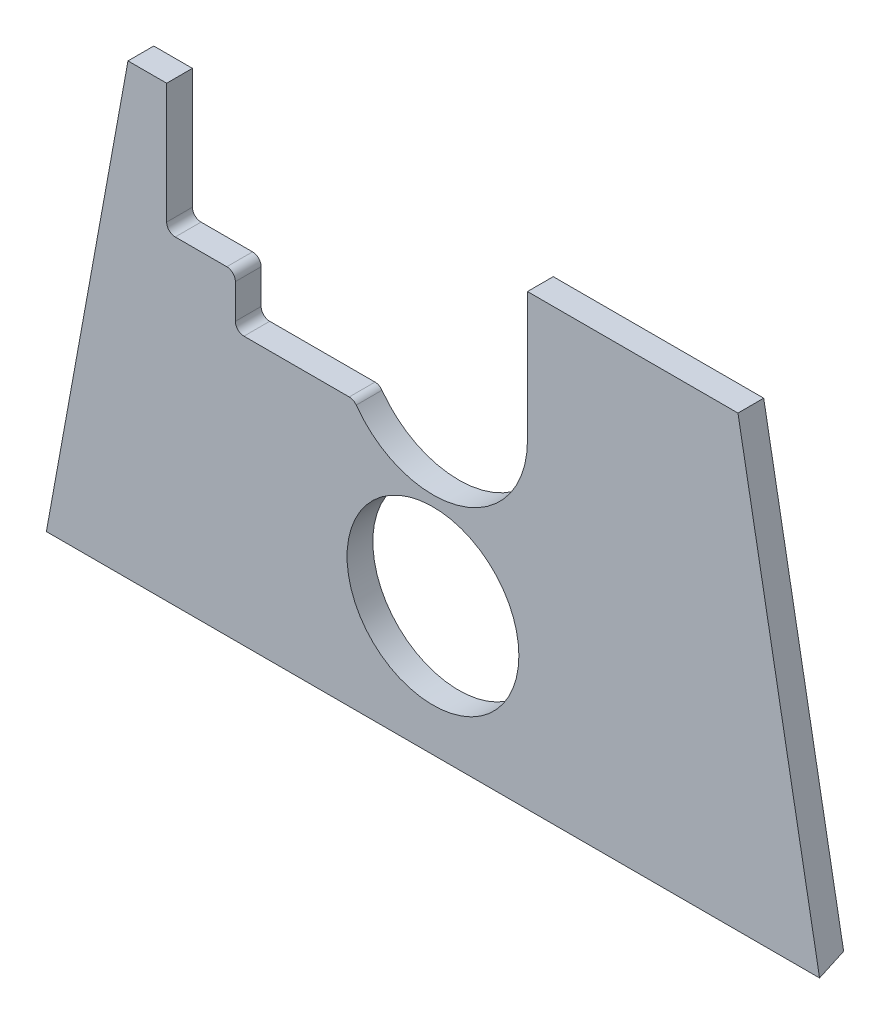
ISO-10303-21;
HEADER;
FILE_DESCRIPTION(('STEP AP214'),'2;1');
FILE_NAME('part.step','',(''),(''),'','','');
FILE_SCHEMA(('AUTOMOTIVE_DESIGN { 1 0 10303 214 1 1 1 1 }'));
ENDSEC;
DATA;
#1=APPLICATION_CONTEXT('core data for automotive mechanical design processes');
#2=APPLICATION_PROTOCOL_DEFINITION('international standard','automotive_design',2000,#1);
#3=PRODUCT_CONTEXT('',#1,'mechanical');
#4=PRODUCT('Part','Part','',(#3));
#5=PRODUCT_RELATED_PRODUCT_CATEGORY('part','',(#4));
#6=PRODUCT_DEFINITION_FORMATION('','',#4);
#7=PRODUCT_DEFINITION_CONTEXT('part definition',#1,'design');
#8=PRODUCT_DEFINITION('design','',#6,#7);
#9=PRODUCT_DEFINITION_SHAPE('','',#8);
#10=(LENGTH_UNIT() NAMED_UNIT(*) SI_UNIT(.MILLI.,.METRE.));
#11=(NAMED_UNIT(*) PLANE_ANGLE_UNIT() SI_UNIT($,.RADIAN.));
#12=(NAMED_UNIT(*) SI_UNIT($,.STERADIAN.) SOLID_ANGLE_UNIT());
#13=UNCERTAINTY_MEASURE_WITH_UNIT(LENGTH_MEASURE(1.E-05),#10,'distance_accuracy_value','');
#14=(GEOMETRIC_REPRESENTATION_CONTEXT(3) GLOBAL_UNCERTAINTY_ASSIGNED_CONTEXT((#13)) GLOBAL_UNIT_ASSIGNED_CONTEXT((#10,
#11,#12)) REPRESENTATION_CONTEXT('',''));
#15=CARTESIAN_POINT('',(0.,0.,0.));
#16=DIRECTION('',(0.,0.,1.));
#17=DIRECTION('',(1.,0.,0.));
#18=AXIS2_PLACEMENT_3D('',#15,#16,#17);
#19=CARTESIAN_POINT('',(-35.5,52.2,1.5));
#20=DIRECTION('',(0.,-1.,0.));
#21=DIRECTION('',(0.,0.,-1.));
#22=AXIS2_PLACEMENT_3D('',#19,#20,#21);
#23=PLANE('',#22);
#24=DIRECTION('',(-1.,0.,0.));
#25=VECTOR('',#24,1.);
#26=CARTESIAN_POINT('',(-35.5,52.2,1.5));
#27=LINE('',#26,#25);
#28=CARTESIAN_POINT('',(-31.,52.2,1.5));
#29=VERTEX_POINT('',#28);
#30=CARTESIAN_POINT('',(-35.5,52.2,1.5));
#31=VERTEX_POINT('',#30);
#32=EDGE_CURVE('E308',#29,#31,#27,.T.);
#33=ORIENTED_EDGE('',*,*,#32,.F.);
#34=DIRECTION('',(0.,0.,1.));
#35=VECTOR('',#34,1.);
#36=CARTESIAN_POINT('',(-31.,52.2,-1.5));
#37=LINE('',#36,#35);
#38=CARTESIAN_POINT('',(-31.,52.2,-1.5));
#39=VERTEX_POINT('',#38);
#40=EDGE_CURVE('E161',#39,#29,#37,.T.);
#41=ORIENTED_EDGE('',*,*,#40,.F.);
#42=DIRECTION('',(-1.,0.,0.));
#43=VECTOR('',#42,1.);
#44=CARTESIAN_POINT('',(-35.5,52.2,-1.5));
#45=LINE('',#44,#43);
#46=CARTESIAN_POINT('',(-35.5,52.2,-1.5));
#47=VERTEX_POINT('',#46);
#48=EDGE_CURVE('E180',#39,#47,#45,.T.);
#49=ORIENTED_EDGE('',*,*,#48,.T.);
#50=DIRECTION('',(0.,0.,-1.));
#51=VECTOR('',#50,1.);
#52=CARTESIAN_POINT('',(-35.5,52.2,1.5));
#53=LINE('',#52,#51);
#54=EDGE_CURVE('E191',#31,#47,#53,.T.);
#55=ORIENTED_EDGE('',*,*,#54,.F.);
#56=EDGE_LOOP('',(#33,#41,#49,#55));
#57=FACE_BOUND('',#56,.T.);
#58=ADVANCED_FACE('F40',(#57),#23,.F.);
#59=CARTESIAN_POINT('',(35.5,52.2,1.5));
#60=DIRECTION('',(-0.983839740112605,-0.179051293698654,0.));
#61=DIRECTION('',(0.179051293698654,-0.983839740112605,0.));
#62=AXIS2_PLACEMENT_3D('',#59,#60,#61);
#63=PLANE('',#62);
#64=DIRECTION('',(-0.179051293698654,0.983839740112605,0.));
#65=VECTOR('',#64,1.);
#66=CARTESIAN_POINT('',(35.5,52.2,1.5));
#67=LINE('',#66,#65);
#68=CARTESIAN_POINT('',(45.,0.,1.5));
#69=VERTEX_POINT('',#68);
#70=CARTESIAN_POINT('',(35.5,52.2,1.5));
#71=VERTEX_POINT('',#70);
#72=EDGE_CURVE('E185',#69,#71,#67,.T.);
#73=ORIENTED_EDGE('',*,*,#72,.F.);
#74=DIRECTION('',(0.0621248119839871,-0.341359493217276,0.937877499530935));
#75=VECTOR('',#74,1.);
#76=CARTESIAN_POINT('',(44.6526456962359,1.90862049015652,-3.74389169901341));
#77=LINE('',#76,#75);
#78=CARTESIAN_POINT('',(44.8012806192225,1.09191070279862,-1.5));
#79=VERTEX_POINT('',#78);
#80=EDGE_CURVE('E198',#69,#79,#77,.F.);
#81=ORIENTED_EDGE('',*,*,#80,.T.);
#82=DIRECTION('',(-0.179051293698654,0.983839740112605,0.));
#83=VECTOR('',#82,1.);
#84=CARTESIAN_POINT('',(35.5,52.2,-1.5));
#85=LINE('',#84,#83);
#86=CARTESIAN_POINT('',(35.5,52.2,-1.5));
#87=VERTEX_POINT('',#86);
#88=EDGE_CURVE('E187',#79,#87,#85,.T.);
#89=ORIENTED_EDGE('',*,*,#88,.T.);
#90=DIRECTION('',(0.,0.,-1.));
#91=VECTOR('',#90,1.);
#92=CARTESIAN_POINT('',(35.5,52.2,1.5));
#93=LINE('',#92,#91);
#94=EDGE_CURVE('E177',#71,#87,#93,.T.);
#95=ORIENTED_EDGE('',*,*,#94,.F.);
#96=EDGE_LOOP('',(#73,#81,#89,#95));
#97=FACE_BOUND('',#96,.T.);
#98=ADVANCED_FACE('F323',(#97),#63,.F.);
#99=CARTESIAN_POINT('',(11.,52.2,-1.5));
#100=VERTEX_POINT('',#99);
#101=EDGE_CURVE('E168',#87,#100,#45,.T.);
#102=ORIENTED_EDGE('',*,*,#101,.T.);
#103=DIRECTION('',(0.,0.,1.));
#104=VECTOR('',#103,1.);
#105=CARTESIAN_POINT('',(11.,52.2,-1.5));
#106=LINE('',#105,#104);
#107=CARTESIAN_POINT('',(11.,52.2,1.5));
#108=VERTEX_POINT('',#107);
#109=EDGE_CURVE('E149',#100,#108,#106,.T.);
#110=ORIENTED_EDGE('',*,*,#109,.T.);
#111=EDGE_CURVE('E309',#71,#108,#27,.T.);
#112=ORIENTED_EDGE('',*,*,#111,.F.);
#113=ORIENTED_EDGE('',*,*,#94,.T.);
#114=EDGE_LOOP('',(#102,#110,#112,#113));
#115=FACE_BOUND('',#114,.T.);
#116=ADVANCED_FACE('F175',(#115),#23,.F.);
#117=CARTESIAN_POINT('',(-45.,0.,1.5));
#118=DIRECTION('',(0.983839740112605,-0.179051293698654,0.));
#119=DIRECTION('',(0.179051293698654,0.983839740112605,0.));
#120=AXIS2_PLACEMENT_3D('',#117,#118,#119);
#121=PLANE('',#120);
#122=DIRECTION('',(-0.179051293698654,-0.983839740112605,0.));
#123=VECTOR('',#122,1.);
#124=CARTESIAN_POINT('',(-45.,0.,-1.5));
#125=LINE('',#124,#123);
#126=CARTESIAN_POINT('',(-44.8012806192225,1.09191070279861,-1.5));
#127=VERTEX_POINT('',#126);
#128=EDGE_CURVE('E179',#47,#127,#125,.T.);
#129=ORIENTED_EDGE('',*,*,#128,.T.);
#130=DIRECTION('',(0.0621248119839871,0.341359493217276,-0.937877499530935));
#131=VECTOR('',#130,1.);
#132=CARTESIAN_POINT('',(-45.,0.,1.5));
#133=LINE('',#132,#131);
#134=CARTESIAN_POINT('',(-45.,0.,1.5));
#135=VERTEX_POINT('',#134);
#136=EDGE_CURVE('E204',#127,#135,#133,.F.);
#137=ORIENTED_EDGE('',*,*,#136,.T.);
#138=DIRECTION('',(-0.179051293698654,-0.983839740112605,0.));
#139=VECTOR('',#138,1.);
#140=CARTESIAN_POINT('',(-45.,0.,1.5));
#141=LINE('',#140,#139);
#142=EDGE_CURVE('E312',#31,#135,#141,.T.);
#143=ORIENTED_EDGE('',*,*,#142,.F.);
#144=ORIENTED_EDGE('',*,*,#54,.T.);
#145=EDGE_LOOP('',(#129,#137,#143,#144));
#146=FACE_BOUND('',#145,.T.);
#147=ADVANCED_FACE('F375',(#146),#121,.F.);
#148=CARTESIAN_POINT('',(0.,0.,1.5));
#149=DIRECTION('',(0.,0.,1.));
#150=DIRECTION('',(1.,0.,0.));
#151=AXIS2_PLACEMENT_3D('',#148,#149,#150);
#152=PLANE('',#151);
#153=CARTESIAN_POINT('',(0.,15.,1.5));
#154=DIRECTION('',(0.,0.,1.));
#155=DIRECTION('',(1.,0.,0.));
#156=AXIS2_PLACEMENT_3D('',#153,#154,#155);
#157=CIRCLE('',#156,10.);
#158=CARTESIAN_POINT('',(10.,15.,1.5));
#159=VERTEX_POINT('',#158);
#160=EDGE_CURVE('E301',#159,#159,#157,.T.);
#161=ORIENTED_EDGE('',*,*,#160,.F.);
#162=EDGE_LOOP('',(#161));
#163=FACE_BOUND('',#162,.T.);
#164=CARTESIAN_POINT('',(0.,37.2,1.5));
#165=DIRECTION('',(0.,0.,1.));
#166=DIRECTION('',(1.,0.,0.));
#167=AXIS2_PLACEMENT_3D('',#164,#165,#166);
#168=CIRCLE('',#167,11.);
#169=CARTESIAN_POINT('',(-8.93456148274155,30.7833333333333,1.5));
#170=VERTEX_POINT('',#169);
#171=CARTESIAN_POINT('',(11.,37.2,1.5));
#172=VERTEX_POINT('',#171);
#173=EDGE_CURVE('E289',#170,#172,#168,.T.);
#174=ORIENTED_EDGE('',*,*,#173,.F.);
#175=CARTESIAN_POINT('',(-9.74679434480896,30.2,1.5));
#176=DIRECTION('',(0.,0.,1.));
#177=DIRECTION('',(1.,0.,0.));
#178=AXIS2_PLACEMENT_3D('',#175,#176,#177);
#179=CIRCLE('',#178,1.);
#180=CARTESIAN_POINT('',(-9.74679434480896,31.2,1.5));
#181=VERTEX_POINT('',#180);
#182=EDGE_CURVE('E214',#170,#181,#179,.T.);
#183=ORIENTED_EDGE('',*,*,#182,.T.);
#184=DIRECTION('',(1.,0.,0.));
#185=VECTOR('',#184,1.);
#186=CARTESIAN_POINT('',(0.,31.2,1.5));
#187=LINE('',#186,#185);
#188=CARTESIAN_POINT('',(-22.,31.2,1.5));
#189=VERTEX_POINT('',#188);
#190=EDGE_CURVE('E285',#189,#181,#187,.T.);
#191=ORIENTED_EDGE('',*,*,#190,.F.);
#192=CARTESIAN_POINT('',(-22.,32.2,1.5));
#193=DIRECTION('',(0.,0.,1.));
#194=DIRECTION('',(1.,0.,0.));
#195=AXIS2_PLACEMENT_3D('',#192,#193,#194);
#196=CIRCLE('',#195,1.);
#197=CARTESIAN_POINT('',(-23.,32.2,1.5));
#198=VERTEX_POINT('',#197);
#199=EDGE_CURVE('E245',#189,#198,#196,.F.);
#200=ORIENTED_EDGE('',*,*,#199,.T.);
#201=DIRECTION('',(0.,-1.,0.));
#202=VECTOR('',#201,1.);
#203=CARTESIAN_POINT('',(-23.,0.,1.5));
#204=LINE('',#203,#202);
#205=CARTESIAN_POINT('',(-23.,36.2,1.5));
#206=VERTEX_POINT('',#205);
#207=EDGE_CURVE('E296',#206,#198,#204,.T.);
#208=ORIENTED_EDGE('',*,*,#207,.F.);
#209=CARTESIAN_POINT('',(-24.,36.2,1.5));
#210=DIRECTION('',(0.,0.,1.));
#211=DIRECTION('',(1.,0.,0.));
#212=AXIS2_PLACEMENT_3D('',#209,#210,#211);
#213=CIRCLE('',#212,1.);
#214=CARTESIAN_POINT('',(-24.,37.2,1.5));
#215=VERTEX_POINT('',#214);
#216=EDGE_CURVE('E211',#206,#215,#213,.T.);
#217=ORIENTED_EDGE('',*,*,#216,.T.);
#218=DIRECTION('',(-1.,0.,0.));
#219=VECTOR('',#218,1.);
#220=CARTESIAN_POINT('',(0.,37.2,1.5));
#221=LINE('',#220,#219);
#222=CARTESIAN_POINT('',(-30.,37.2,1.5));
#223=VERTEX_POINT('',#222);
#224=EDGE_CURVE('E260',#215,#223,#221,.T.);
#225=ORIENTED_EDGE('',*,*,#224,.T.);
#226=CARTESIAN_POINT('',(-30.,38.2,1.5));
#227=DIRECTION('',(0.,0.,1.));
#228=DIRECTION('',(1.,0.,0.));
#229=AXIS2_PLACEMENT_3D('',#226,#227,#228);
#230=CIRCLE('',#229,1.);
#231=CARTESIAN_POINT('',(-31.,38.2,1.5));
#232=VERTEX_POINT('',#231);
#233=EDGE_CURVE('E49',#223,#232,#230,.F.);
#234=ORIENTED_EDGE('',*,*,#233,.T.);
#235=DIRECTION('',(0.,-1.,0.));
#236=VECTOR('',#235,1.);
#237=CARTESIAN_POINT('',(-31.,0.,1.5));
#238=LINE('',#237,#236);
#239=EDGE_CURVE('E257',#29,#232,#238,.T.);
#240=ORIENTED_EDGE('',*,*,#239,.F.);
#241=ORIENTED_EDGE('',*,*,#32,.T.);
#242=ORIENTED_EDGE('',*,*,#142,.T.);
#243=DIRECTION('',(1.,0.,0.));
#244=VECTOR('',#243,1.);
#245=CARTESIAN_POINT('',(-45.,0.,1.5));
#246=LINE('',#245,#244);
#247=EDGE_CURVE('E195',#135,#69,#246,.T.);
#248=ORIENTED_EDGE('',*,*,#247,.T.);
#249=ORIENTED_EDGE('',*,*,#72,.T.);
#250=ORIENTED_EDGE('',*,*,#111,.T.);
#251=DIRECTION('',(0.,1.,0.));
#252=VECTOR('',#251,1.);
#253=CARTESIAN_POINT('',(11.,0.,1.5));
#254=LINE('',#253,#252);
#255=EDGE_CURVE('E156',#172,#108,#254,.T.);
#256=ORIENTED_EDGE('',*,*,#255,.F.);
#257=EDGE_LOOP('',(#174,#183,#191,#200,#208,#217,#225,#234,#240,#241,#242,#248,#249,#250,#256));
#258=FACE_BOUND('',#257,.T.);
#259=ADVANCED_FACE('F256',(#163,#258),#152,.T.);
#260=CARTESIAN_POINT('',(0.,0.,-1.5));
#261=DIRECTION('',(0.,0.,1.));
#262=DIRECTION('',(1.,0.,0.));
#263=AXIS2_PLACEMENT_3D('',#260,#261,#262);
#264=PLANE('',#263);
#265=CARTESIAN_POINT('',(0.,15.,-1.5));
#266=DIRECTION('',(0.,0.,1.));
#267=DIRECTION('',(1.,0.,0.));
#268=AXIS2_PLACEMENT_3D('',#265,#266,#267);
#269=CIRCLE('',#268,10.);
#270=CARTESIAN_POINT('',(10.,15.,-1.5));
#271=VERTEX_POINT('',#270);
#272=EDGE_CURVE('E326',#271,#271,#269,.T.);
#273=ORIENTED_EDGE('',*,*,#272,.T.);
#274=EDGE_LOOP('',(#273));
#275=FACE_BOUND('',#274,.T.);
#276=DIRECTION('',(1.,0.,0.));
#277=VECTOR('',#276,1.);
#278=CARTESIAN_POINT('',(0.,31.2,-1.5));
#279=LINE('',#278,#277);
#280=CARTESIAN_POINT('',(-22.,31.2,-1.5));
#281=VERTEX_POINT('',#280);
#282=CARTESIAN_POINT('',(-9.74679434480896,31.2,-1.5));
#283=VERTEX_POINT('',#282);
#284=EDGE_CURVE('E299',#281,#283,#279,.T.);
#285=ORIENTED_EDGE('',*,*,#284,.T.);
#286=CARTESIAN_POINT('',(-9.74679434480896,30.2,-1.5));
#287=DIRECTION('',(0.,0.,1.));
#288=DIRECTION('',(1.,0.,0.));
#289=AXIS2_PLACEMENT_3D('',#286,#287,#288);
#290=CIRCLE('',#289,1.);
#291=CARTESIAN_POINT('',(-8.93456148274155,30.7833333333333,-1.5));
#292=VERTEX_POINT('',#291);
#293=EDGE_CURVE('E226',#283,#292,#290,.F.);
#294=ORIENTED_EDGE('',*,*,#293,.T.);
#295=CARTESIAN_POINT('',(0.,37.2,-1.5));
#296=DIRECTION('',(0.,0.,1.));
#297=DIRECTION('',(1.,0.,0.));
#298=AXIS2_PLACEMENT_3D('',#295,#296,#297);
#299=CIRCLE('',#298,11.);
#300=CARTESIAN_POINT('',(11.,37.2,-1.5));
#301=VERTEX_POINT('',#300);
#302=EDGE_CURVE('E171',#292,#301,#299,.T.);
#303=ORIENTED_EDGE('',*,*,#302,.T.);
#304=DIRECTION('',(0.,1.,0.));
#305=VECTOR('',#304,1.);
#306=CARTESIAN_POINT('',(11.,0.,-1.5));
#307=LINE('',#306,#305);
#308=EDGE_CURVE('E153',#301,#100,#307,.T.);
#309=ORIENTED_EDGE('',*,*,#308,.T.);
#310=ORIENTED_EDGE('',*,*,#101,.F.);
#311=ORIENTED_EDGE('',*,*,#88,.F.);
#312=DIRECTION('',(-1.,0.,0.));
#313=VECTOR('',#312,1.);
#314=CARTESIAN_POINT('',(0.,1.09191070279861,-1.5));
#315=LINE('',#314,#313);
#316=EDGE_CURVE('E201',#79,#127,#315,.T.);
#317=ORIENTED_EDGE('',*,*,#316,.T.);
#318=ORIENTED_EDGE('',*,*,#128,.F.);
#319=ORIENTED_EDGE('',*,*,#48,.F.);
#320=DIRECTION('',(0.,-1.,0.));
#321=VECTOR('',#320,1.);
#322=CARTESIAN_POINT('',(-31.,0.,-1.5));
#323=LINE('',#322,#321);
#324=CARTESIAN_POINT('',(-31.,38.2,-1.5));
#325=VERTEX_POINT('',#324);
#326=EDGE_CURVE('E173',#39,#325,#323,.T.);
#327=ORIENTED_EDGE('',*,*,#326,.T.);
#328=CARTESIAN_POINT('',(-30.,38.2,-1.5));
#329=DIRECTION('',(0.,0.,1.));
#330=DIRECTION('',(1.,0.,0.));
#331=AXIS2_PLACEMENT_3D('',#328,#329,#330);
#332=CIRCLE('',#331,1.);
#333=CARTESIAN_POINT('',(-30.,37.2,-1.5));
#334=VERTEX_POINT('',#333);
#335=EDGE_CURVE('E11',#325,#334,#332,.T.);
#336=ORIENTED_EDGE('',*,*,#335,.T.);
#337=DIRECTION('',(-1.,0.,0.));
#338=VECTOR('',#337,1.);
#339=CARTESIAN_POINT('',(0.,37.2,-1.5));
#340=LINE('',#339,#338);
#341=CARTESIAN_POINT('',(-24.,37.2,-1.5));
#342=VERTEX_POINT('',#341);
#343=EDGE_CURVE('E272',#342,#334,#340,.T.);
#344=ORIENTED_EDGE('',*,*,#343,.F.);
#345=CARTESIAN_POINT('',(-24.,36.2,-1.5));
#346=DIRECTION('',(0.,0.,1.));
#347=DIRECTION('',(1.,0.,0.));
#348=AXIS2_PLACEMENT_3D('',#345,#346,#347);
#349=CIRCLE('',#348,1.);
#350=CARTESIAN_POINT('',(-23.,36.2,-1.5));
#351=VERTEX_POINT('',#350);
#352=EDGE_CURVE('E63',#342,#351,#349,.F.);
#353=ORIENTED_EDGE('',*,*,#352,.T.);
#354=DIRECTION('',(0.,-1.,0.));
#355=VECTOR('',#354,1.);
#356=CARTESIAN_POINT('',(-23.,0.,-1.5));
#357=LINE('',#356,#355);
#358=CARTESIAN_POINT('',(-23.,32.2,-1.5));
#359=VERTEX_POINT('',#358);
#360=EDGE_CURVE('E278',#351,#359,#357,.T.);
#361=ORIENTED_EDGE('',*,*,#360,.T.);
#362=CARTESIAN_POINT('',(-22.,32.2,-1.5));
#363=DIRECTION('',(0.,0.,1.));
#364=DIRECTION('',(1.,0.,0.));
#365=AXIS2_PLACEMENT_3D('',#362,#363,#364);
#366=CIRCLE('',#365,1.);
#367=EDGE_CURVE('E248',#359,#281,#366,.T.);
#368=ORIENTED_EDGE('',*,*,#367,.T.);
#369=EDGE_LOOP('',(#285,#294,#303,#309,#310,#311,#317,#318,#319,#327,#336,#344,#353,#361,#368));
#370=FACE_BOUND('',#369,.T.);
#371=ADVANCED_FACE('F166',(#275,#370),#264,.F.);
#372=CARTESIAN_POINT('',(-45.,0.,1.5));
#373=DIRECTION('',(0.,0.939692620785908,0.34202014332567));
#374=DIRECTION('',(1.,0.,0.));
#375=AXIS2_PLACEMENT_3D('',#372,#373,#374);
#376=PLANE('',#375);
#377=ORIENTED_EDGE('',*,*,#136,.F.);
#378=ORIENTED_EDGE('',*,*,#316,.F.);
#379=ORIENTED_EDGE('',*,*,#80,.F.);
#380=ORIENTED_EDGE('',*,*,#247,.F.);
#381=EDGE_LOOP('',(#377,#378,#379,#380));
#382=FACE_BOUND('',#381,.T.);
#383=ADVANCED_FACE('F389',(#382),#376,.F.);
#384=CARTESIAN_POINT('',(0.,31.2,-1.5));
#385=DIRECTION('',(0.,-1.,0.));
#386=DIRECTION('',(0.,0.,-1.));
#387=AXIS2_PLACEMENT_3D('',#384,#385,#386);
#388=PLANE('',#387);
#389=ORIENTED_EDGE('',*,*,#190,.T.);
#390=DIRECTION('',(0.,0.,1.));
#391=VECTOR('',#390,1.);
#392=CARTESIAN_POINT('',(-9.74679434480896,31.2,-1.5));
#393=LINE('',#392,#391);
#394=EDGE_CURVE('E221',#181,#283,#393,.F.);
#395=ORIENTED_EDGE('',*,*,#394,.T.);
#396=ORIENTED_EDGE('',*,*,#284,.F.);
#397=DIRECTION('',(0.,0.,1.));
#398=VECTOR('',#397,1.);
#399=CARTESIAN_POINT('',(-22.,31.2,1.5));
#400=LINE('',#399,#398);
#401=EDGE_CURVE('E217',#281,#189,#400,.T.);
#402=ORIENTED_EDGE('',*,*,#401,.T.);
#403=EDGE_LOOP('',(#389,#395,#396,#402));
#404=FACE_BOUND('',#403,.T.);
#405=ADVANCED_FACE('F351',(#404),#388,.F.);
#406=CARTESIAN_POINT('',(-23.,0.,-1.5));
#407=DIRECTION('',(-1.,0.,0.));
#408=DIRECTION('',(0.,0.,1.));
#409=AXIS2_PLACEMENT_3D('',#406,#407,#408);
#410=PLANE('',#409);
#411=ORIENTED_EDGE('',*,*,#207,.T.);
#412=DIRECTION('',(0.,0.,1.));
#413=VECTOR('',#412,1.);
#414=CARTESIAN_POINT('',(-23.,32.2,-1.5));
#415=LINE('',#414,#413);
#416=EDGE_CURVE('E56',#198,#359,#415,.F.);
#417=ORIENTED_EDGE('',*,*,#416,.T.);
#418=ORIENTED_EDGE('',*,*,#360,.F.);
#419=DIRECTION('',(0.,0.,1.));
#420=VECTOR('',#419,1.);
#421=CARTESIAN_POINT('',(-23.,36.2,1.5));
#422=LINE('',#421,#420);
#423=EDGE_CURVE('E229',#351,#206,#422,.T.);
#424=ORIENTED_EDGE('',*,*,#423,.T.);
#425=EDGE_LOOP('',(#411,#417,#418,#424));
#426=FACE_BOUND('',#425,.T.);
#427=ADVANCED_FACE('F355',(#426),#410,.F.);
#428=CARTESIAN_POINT('',(0.,37.2,-1.5));
#429=DIRECTION('',(0.,1.,0.));
#430=DIRECTION('',(0.,0.,1.));
#431=AXIS2_PLACEMENT_3D('',#428,#429,#430);
#432=PLANE('',#431);
#433=ORIENTED_EDGE('',*,*,#224,.F.);
#434=DIRECTION('',(0.,0.,1.));
#435=VECTOR('',#434,1.);
#436=CARTESIAN_POINT('',(-24.,37.2,-1.5));
#437=LINE('',#436,#435);
#438=EDGE_CURVE('E239',#215,#342,#437,.F.);
#439=ORIENTED_EDGE('',*,*,#438,.T.);
#440=ORIENTED_EDGE('',*,*,#343,.T.);
#441=DIRECTION('',(0.,0.,1.));
#442=VECTOR('',#441,1.);
#443=CARTESIAN_POINT('',(-30.,37.2,-1.5));
#444=LINE('',#443,#442);
#445=EDGE_CURVE('E235',#334,#223,#444,.T.);
#446=ORIENTED_EDGE('',*,*,#445,.T.);
#447=EDGE_LOOP('',(#433,#439,#440,#446));
#448=FACE_BOUND('',#447,.T.);
#449=ADVANCED_FACE('F275',(#448),#432,.T.);
#450=CARTESIAN_POINT('',(-31.,0.,-1.5));
#451=DIRECTION('',(-1.,0.,0.));
#452=DIRECTION('',(0.,0.,1.));
#453=AXIS2_PLACEMENT_3D('',#450,#451,#452);
#454=PLANE('',#453);
#455=ORIENTED_EDGE('',*,*,#239,.T.);
#456=DIRECTION('',(0.,0.,1.));
#457=VECTOR('',#456,1.);
#458=CARTESIAN_POINT('',(-31.,38.2,-1.5));
#459=LINE('',#458,#457);
#460=EDGE_CURVE('E242',#232,#325,#459,.F.);
#461=ORIENTED_EDGE('',*,*,#460,.T.);
#462=ORIENTED_EDGE('',*,*,#326,.F.);
#463=ORIENTED_EDGE('',*,*,#40,.T.);
#464=EDGE_LOOP('',(#455,#461,#462,#463));
#465=FACE_BOUND('',#464,.T.);
#466=ADVANCED_FACE('F265',(#465),#454,.F.);
#467=CARTESIAN_POINT('',(11.,0.,-1.5));
#468=DIRECTION('',(1.,0.,0.));
#469=DIRECTION('',(0.,0.,-1.));
#470=AXIS2_PLACEMENT_3D('',#467,#468,#469);
#471=PLANE('',#470);
#472=ORIENTED_EDGE('',*,*,#255,.T.);
#473=ORIENTED_EDGE('',*,*,#109,.F.);
#474=ORIENTED_EDGE('',*,*,#308,.F.);
#475=DIRECTION('',(0.,0.,1.));
#476=VECTOR('',#475,1.);
#477=CARTESIAN_POINT('',(11.,37.2,-1.5));
#478=LINE('',#477,#476);
#479=EDGE_CURVE('E162',#301,#172,#478,.T.);
#480=ORIENTED_EDGE('',*,*,#479,.T.);
#481=EDGE_LOOP('',(#472,#473,#474,#480));
#482=FACE_BOUND('',#481,.T.);
#483=ADVANCED_FACE('F151',(#482),#471,.F.);
#484=CARTESIAN_POINT('',(0.,37.2,-1.5));
#485=DIRECTION('',(0.,0.,1.));
#486=DIRECTION('',(1.,0.,0.));
#487=AXIS2_PLACEMENT_3D('',#484,#485,#486);
#488=CYLINDRICAL_SURFACE('',#487,11.);
#489=ORIENTED_EDGE('',*,*,#302,.F.);
#490=DIRECTION('',(0.,0.,1.));
#491=VECTOR('',#490,1.);
#492=CARTESIAN_POINT('',(-8.93456148274155,30.7833333333333,-1.5));
#493=LINE('',#492,#491);
#494=EDGE_CURVE('E207',#292,#170,#493,.T.);
#495=ORIENTED_EDGE('',*,*,#494,.T.);
#496=ORIENTED_EDGE('',*,*,#173,.T.);
#497=ORIENTED_EDGE('',*,*,#479,.F.);
#498=EDGE_LOOP('',(#489,#495,#496,#497));
#499=FACE_BOUND('',#498,.T.);
#500=ADVANCED_FACE('F349',(#499),#488,.F.);
#501=CARTESIAN_POINT('',(0.,15.,-1.5));
#502=DIRECTION('',(0.,0.,1.));
#503=DIRECTION('',(1.,0.,0.));
#504=AXIS2_PLACEMENT_3D('',#501,#502,#503);
#505=CYLINDRICAL_SURFACE('',#504,10.);
#506=ORIENTED_EDGE('',*,*,#272,.F.);
#507=EDGE_LOOP('',(#506));
#508=FACE_BOUND('',#507,.T.);
#509=ORIENTED_EDGE('',*,*,#160,.T.);
#510=EDGE_LOOP('',(#509));
#511=FACE_BOUND('',#510,.T.);
#512=ADVANCED_FACE('F395',(#508,#511),#505,.F.);
#513=CARTESIAN_POINT('',(-9.74679434480896,30.2,-1.5));
#514=DIRECTION('',(0.,0.,1.));
#515=DIRECTION('',(1.,0.,0.));
#516=AXIS2_PLACEMENT_3D('',#513,#514,#515);
#517=CYLINDRICAL_SURFACE('',#516,1.);
#518=ORIENTED_EDGE('',*,*,#293,.F.);
#519=ORIENTED_EDGE('',*,*,#394,.F.);
#520=ORIENTED_EDGE('',*,*,#182,.F.);
#521=ORIENTED_EDGE('',*,*,#494,.F.);
#522=EDGE_LOOP('',(#518,#519,#520,#521));
#523=FACE_BOUND('',#522,.T.);
#524=ADVANCED_FACE('F347',(#523),#517,.T.);
#525=CARTESIAN_POINT('',(-22.,32.2,-1.5));
#526=DIRECTION('',(0.,0.,-1.));
#527=DIRECTION('',(-1.,0.,0.));
#528=AXIS2_PLACEMENT_3D('',#525,#526,#527);
#529=CYLINDRICAL_SURFACE('',#528,1.);
#530=ORIENTED_EDGE('',*,*,#367,.F.);
#531=ORIENTED_EDGE('',*,*,#416,.F.);
#532=ORIENTED_EDGE('',*,*,#199,.F.);
#533=ORIENTED_EDGE('',*,*,#401,.F.);
#534=EDGE_LOOP('',(#530,#531,#532,#533));
#535=FACE_BOUND('',#534,.T.);
#536=ADVANCED_FACE('F353',(#535),#529,.F.);
#537=CARTESIAN_POINT('',(-24.,36.2,-1.5));
#538=DIRECTION('',(0.,0.,-1.));
#539=DIRECTION('',(-1.,0.,0.));
#540=AXIS2_PLACEMENT_3D('',#537,#538,#539);
#541=CYLINDRICAL_SURFACE('',#540,1.);
#542=ORIENTED_EDGE('',*,*,#352,.F.);
#543=ORIENTED_EDGE('',*,*,#438,.F.);
#544=ORIENTED_EDGE('',*,*,#216,.F.);
#545=ORIENTED_EDGE('',*,*,#423,.F.);
#546=EDGE_LOOP('',(#542,#543,#544,#545));
#547=FACE_BOUND('',#546,.T.);
#548=ADVANCED_FACE('F358',(#547),#541,.T.);
#549=CARTESIAN_POINT('',(-30.,38.2,-1.5));
#550=DIRECTION('',(0.,0.,1.));
#551=DIRECTION('',(1.,0.,0.));
#552=AXIS2_PLACEMENT_3D('',#549,#550,#551);
#553=CYLINDRICAL_SURFACE('',#552,1.);
#554=ORIENTED_EDGE('',*,*,#335,.F.);
#555=ORIENTED_EDGE('',*,*,#460,.F.);
#556=ORIENTED_EDGE('',*,*,#233,.F.);
#557=ORIENTED_EDGE('',*,*,#445,.F.);
#558=EDGE_LOOP('',(#554,#555,#556,#557));
#559=FACE_BOUND('',#558,.T.);
#560=ADVANCED_FACE('F42',(#559),#553,.F.);
#561=CLOSED_SHELL('',(#58,#98,#116,#147,#259,#371,#383,#405,#427,#449,#466,#483,#500,#512,#524,
#536,#548,#560));
#562=MANIFOLD_SOLID_BREP('B2',#561);
#563=ADVANCED_BREP_SHAPE_REPRESENTATION('',(#18,#562),#14);
#564=SHAPE_DEFINITION_REPRESENTATION(#9,#563);
ENDSEC;
END-ISO-10303-21;
